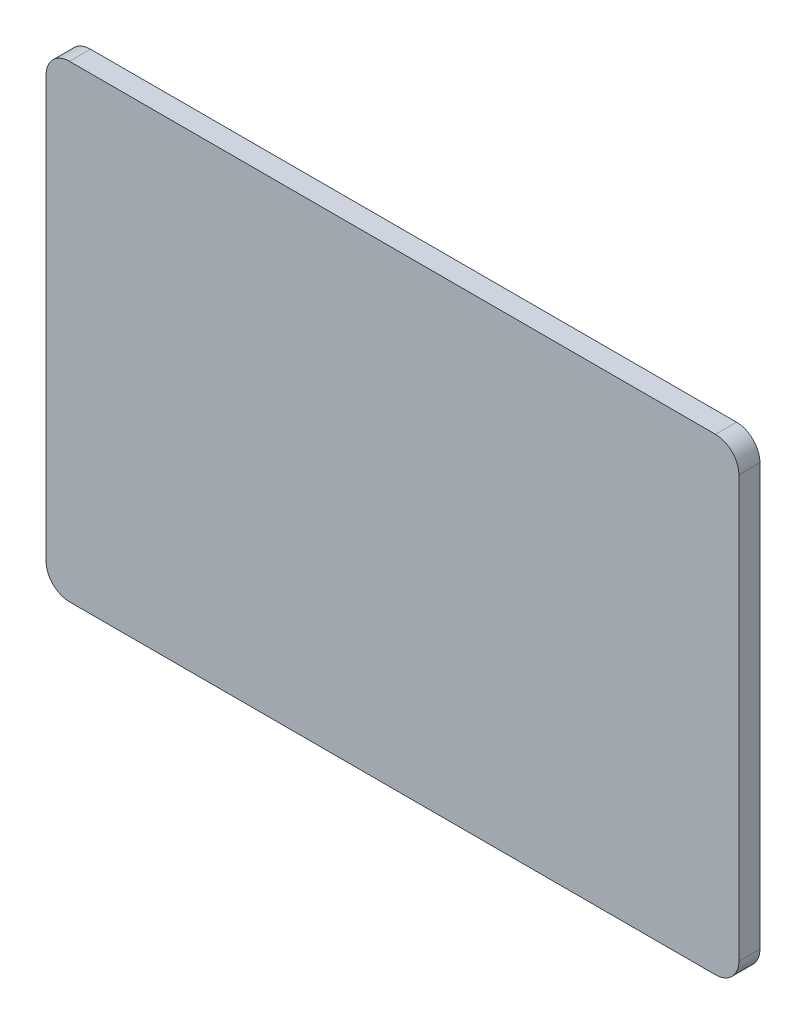
ISO-10303-21;
HEADER;
FILE_DESCRIPTION(('STEP AP214'),'2;1');
FILE_NAME('part.step','',(''),(''),'','','');
FILE_SCHEMA(('AUTOMOTIVE_DESIGN { 1 0 10303 214 1 1 1 1 }'));
ENDSEC;
DATA;
#1=APPLICATION_CONTEXT('core data for automotive mechanical design processes');
#2=APPLICATION_PROTOCOL_DEFINITION('international standard','automotive_design',2000,#1);
#3=PRODUCT_CONTEXT('',#1,'mechanical');
#4=PRODUCT('Part','Part','',(#3));
#5=PRODUCT_RELATED_PRODUCT_CATEGORY('part','',(#4));
#6=PRODUCT_DEFINITION_FORMATION('','',#4);
#7=PRODUCT_DEFINITION_CONTEXT('part definition',#1,'design');
#8=PRODUCT_DEFINITION('design','',#6,#7);
#9=PRODUCT_DEFINITION_SHAPE('','',#8);
#10=(LENGTH_UNIT() NAMED_UNIT(*) SI_UNIT(.MILLI.,.METRE.));
#11=(NAMED_UNIT(*) PLANE_ANGLE_UNIT() SI_UNIT($,.RADIAN.));
#12=(NAMED_UNIT(*) SI_UNIT($,.STERADIAN.) SOLID_ANGLE_UNIT());
#13=UNCERTAINTY_MEASURE_WITH_UNIT(LENGTH_MEASURE(1.E-05),#10,'distance_accuracy_value','');
#14=(GEOMETRIC_REPRESENTATION_CONTEXT(3) GLOBAL_UNCERTAINTY_ASSIGNED_CONTEXT((#13)) GLOBAL_UNIT_ASSIGNED_CONTEXT((#10,
#11,#12)) REPRESENTATION_CONTEXT('',''));
#15=CARTESIAN_POINT('',(0.,0.,0.));
#16=DIRECTION('',(0.,0.,1.));
#17=DIRECTION('',(1.,0.,0.));
#18=AXIS2_PLACEMENT_3D('',#15,#16,#17);
#19=CARTESIAN_POINT('',(-0.345,0.225,0.30877));
#20=DIRECTION('',(0.,0.,1.));
#21=DIRECTION('',(-1.,0.,0.));
#22=AXIS2_PLACEMENT_3D('',#19,#20,#21);
#23=CYLINDRICAL_SURFACE('',#22,0.025);
#24=CARTESIAN_POINT('',(-0.345,0.225,0.29754));
#25=DIRECTION('',(0.,0.,-1.));
#26=DIRECTION('',(1.,0.,0.));
#27=AXIS2_PLACEMENT_3D('',#24,#25,#26);
#28=CIRCLE('',#27,0.025);
#29=CARTESIAN_POINT('',(-0.37,0.225,0.29754));
#30=VERTEX_POINT('',#29);
#31=CARTESIAN_POINT('',(-0.345,0.25,0.29754));
#32=VERTEX_POINT('',#31);
#33=EDGE_CURVE('E42',#30,#32,#28,.T.);
#34=ORIENTED_EDGE('',*,*,#33,.F.);
#35=DIRECTION('',(0.,0.,-1.));
#36=VECTOR('',#35,1.);
#37=CARTESIAN_POINT('',(-0.37,0.225,0.29754));
#38=LINE('',#37,#36);
#39=CARTESIAN_POINT('',(-0.37,0.225,0.32));
#40=VERTEX_POINT('',#39);
#41=EDGE_CURVE('E28',#40,#30,#38,.T.);
#42=ORIENTED_EDGE('',*,*,#41,.F.);
#43=CARTESIAN_POINT('',(-0.345,0.225,0.32));
#44=DIRECTION('',(0.,0.,1.));
#45=DIRECTION('',(1.,0.,0.));
#46=AXIS2_PLACEMENT_3D('',#43,#44,#45);
#47=CIRCLE('',#46,0.025);
#48=CARTESIAN_POINT('',(-0.345,0.25,0.32));
#49=VERTEX_POINT('',#48);
#50=EDGE_CURVE('E177',#49,#40,#47,.T.);
#51=ORIENTED_EDGE('',*,*,#50,.F.);
#52=DIRECTION('',(0.,0.,1.));
#53=VECTOR('',#52,1.);
#54=CARTESIAN_POINT('',(-0.345,0.25,0.32));
#55=LINE('',#54,#53);
#56=EDGE_CURVE('E184',#32,#49,#55,.T.);
#57=ORIENTED_EDGE('',*,*,#56,.F.);
#58=EDGE_LOOP('',(#34,#42,#51,#57));
#59=FACE_BOUND('',#58,.T.);
#60=ADVANCED_FACE('F17',(#59),#23,.T.);
#61=CARTESIAN_POINT('',(0.345,-0.225,0.30877));
#62=DIRECTION('',(0.,0.,1.));
#63=DIRECTION('',(-1.,0.,0.));
#64=AXIS2_PLACEMENT_3D('',#61,#62,#63);
#65=CYLINDRICAL_SURFACE('',#64,0.025);
#66=CARTESIAN_POINT('',(0.345,-0.225,0.29754));
#67=DIRECTION('',(0.,0.,-1.));
#68=DIRECTION('',(1.,0.,0.));
#69=AXIS2_PLACEMENT_3D('',#66,#67,#68);
#70=CIRCLE('',#69,0.025);
#71=CARTESIAN_POINT('',(0.37,-0.225,0.29754));
#72=VERTEX_POINT('',#71);
#73=CARTESIAN_POINT('',(0.345,-0.25,0.29754));
#74=VERTEX_POINT('',#73);
#75=EDGE_CURVE('E151',#72,#74,#70,.T.);
#76=ORIENTED_EDGE('',*,*,#75,.F.);
#77=DIRECTION('',(0.,0.,-1.));
#78=VECTOR('',#77,1.);
#79=CARTESIAN_POINT('',(0.37,-0.225,0.29754));
#80=LINE('',#79,#78);
#81=CARTESIAN_POINT('',(0.37,-0.225,0.32));
#82=VERTEX_POINT('',#81);
#83=EDGE_CURVE('E63',#82,#72,#80,.T.);
#84=ORIENTED_EDGE('',*,*,#83,.F.);
#85=CARTESIAN_POINT('',(0.345,-0.225,0.32));
#86=DIRECTION('',(0.,0.,1.));
#87=DIRECTION('',(1.,0.,0.));
#88=AXIS2_PLACEMENT_3D('',#85,#86,#87);
#89=CIRCLE('',#88,0.025);
#90=CARTESIAN_POINT('',(0.345,-0.25,0.32));
#91=VERTEX_POINT('',#90);
#92=EDGE_CURVE('E76',#91,#82,#89,.T.);
#93=ORIENTED_EDGE('',*,*,#92,.F.);
#94=DIRECTION('',(0.,0.,1.));
#95=VECTOR('',#94,1.);
#96=CARTESIAN_POINT('',(0.345,-0.25,0.32));
#97=LINE('',#96,#95);
#98=EDGE_CURVE('E185',#74,#91,#97,.T.);
#99=ORIENTED_EDGE('',*,*,#98,.F.);
#100=EDGE_LOOP('',(#76,#84,#93,#99));
#101=FACE_BOUND('',#100,.T.);
#102=ADVANCED_FACE('F290',(#101),#65,.T.);
#103=CARTESIAN_POINT('',(0.345,0.225,0.30877));
#104=DIRECTION('',(0.,0.,-1.));
#105=DIRECTION('',(1.,0.,0.));
#106=AXIS2_PLACEMENT_3D('',#103,#104,#105);
#107=CYLINDRICAL_SURFACE('',#106,0.025);
#108=CARTESIAN_POINT('',(0.345,0.225,0.29754));
#109=DIRECTION('',(0.,0.,-1.));
#110=DIRECTION('',(1.,0.,0.));
#111=AXIS2_PLACEMENT_3D('',#108,#109,#110);
#112=CIRCLE('',#111,0.025);
#113=CARTESIAN_POINT('',(0.345,0.25,0.29754));
#114=VERTEX_POINT('',#113);
#115=CARTESIAN_POINT('',(0.37,0.225,0.29754));
#116=VERTEX_POINT('',#115);
#117=EDGE_CURVE('E141',#114,#116,#112,.T.);
#118=ORIENTED_EDGE('',*,*,#117,.F.);
#119=DIRECTION('',(0.,0.,-1.));
#120=VECTOR('',#119,1.);
#121=CARTESIAN_POINT('',(0.345,0.25,0.30877));
#122=LINE('',#121,#120);
#123=CARTESIAN_POINT('',(0.345,0.25,0.32));
#124=VERTEX_POINT('',#123);
#125=EDGE_CURVE('E97',#124,#114,#122,.T.);
#126=ORIENTED_EDGE('',*,*,#125,.F.);
#127=CARTESIAN_POINT('',(0.345,0.225,0.32));
#128=DIRECTION('',(0.,0.,1.));
#129=DIRECTION('',(1.,0.,0.));
#130=AXIS2_PLACEMENT_3D('',#127,#128,#129);
#131=CIRCLE('',#130,0.025);
#132=CARTESIAN_POINT('',(0.37,0.225,0.32));
#133=VERTEX_POINT('',#132);
#134=EDGE_CURVE('E143',#133,#124,#131,.T.);
#135=ORIENTED_EDGE('',*,*,#134,.F.);
#136=DIRECTION('',(0.,0.,1.));
#137=VECTOR('',#136,1.);
#138=CARTESIAN_POINT('',(0.37,0.225,0.30877));
#139=LINE('',#138,#137);
#140=EDGE_CURVE('E138',#116,#133,#139,.T.);
#141=ORIENTED_EDGE('',*,*,#140,.F.);
#142=EDGE_LOOP('',(#118,#126,#135,#141));
#143=FACE_BOUND('',#142,.T.);
#144=ADVANCED_FACE('F140',(#143),#107,.T.);
#145=CARTESIAN_POINT('',(-0.37,-0.25,0.30877));
#146=DIRECTION('',(-1.,0.,0.));
#147=DIRECTION('',(0.,0.,1.));
#148=AXIS2_PLACEMENT_3D('',#145,#146,#147);
#149=PLANE('',#148);
#150=DIRECTION('',(0.,1.,0.));
#151=VECTOR('',#150,1.);
#152=CARTESIAN_POINT('',(-0.37,-0.25,0.32));
#153=LINE('',#152,#151);
#154=CARTESIAN_POINT('',(-0.37,-0.225,0.32));
#155=VERTEX_POINT('',#154);
#156=EDGE_CURVE('E11',#155,#40,#153,.T.);
#157=ORIENTED_EDGE('',*,*,#156,.T.);
#158=ORIENTED_EDGE('',*,*,#41,.T.);
#159=DIRECTION('',(0.,1.,0.));
#160=VECTOR('',#159,1.);
#161=CARTESIAN_POINT('',(-0.37,-0.25,0.29754));
#162=LINE('',#161,#160);
#163=CARTESIAN_POINT('',(-0.37,-0.225,0.29754));
#164=VERTEX_POINT('',#163);
#165=EDGE_CURVE('E134',#164,#30,#162,.T.);
#166=ORIENTED_EDGE('',*,*,#165,.F.);
#167=DIRECTION('',(0.,0.,1.));
#168=VECTOR('',#167,1.);
#169=CARTESIAN_POINT('',(-0.37,-0.225,0.30877));
#170=LINE('',#169,#168);
#171=EDGE_CURVE('E130',#164,#155,#170,.T.);
#172=ORIENTED_EDGE('',*,*,#171,.T.);
#173=EDGE_LOOP('',(#157,#158,#166,#172));
#174=FACE_BOUND('',#173,.T.);
#175=ADVANCED_FACE('F282',(#174),#149,.T.);
#176=CARTESIAN_POINT('',(0.,-0.25,0.29754));
#177=DIRECTION('',(0.,0.,1.));
#178=DIRECTION('',(1.,0.,0.));
#179=AXIS2_PLACEMENT_3D('',#176,#177,#178);
#180=PLANE('',#179);
#181=DIRECTION('',(1.,0.,0.));
#182=VECTOR('',#181,1.);
#183=CARTESIAN_POINT('',(0.,0.25,0.29754));
#184=LINE('',#183,#182);
#185=EDGE_CURVE('E149',#32,#114,#184,.T.);
#186=ORIENTED_EDGE('',*,*,#185,.T.);
#187=ORIENTED_EDGE('',*,*,#117,.T.);
#188=DIRECTION('',(0.,1.,0.));
#189=VECTOR('',#188,1.);
#190=CARTESIAN_POINT('',(0.37,-0.25,0.29754));
#191=LINE('',#190,#189);
#192=EDGE_CURVE('E145',#72,#116,#191,.T.);
#193=ORIENTED_EDGE('',*,*,#192,.F.);
#194=ORIENTED_EDGE('',*,*,#75,.T.);
#195=DIRECTION('',(1.,0.,0.));
#196=VECTOR('',#195,1.);
#197=CARTESIAN_POINT('',(0.,-0.25,0.29754));
#198=LINE('',#197,#196);
#199=CARTESIAN_POINT('',(-0.345,-0.25,0.29754));
#200=VERTEX_POINT('',#199);
#201=EDGE_CURVE('E122',#200,#74,#198,.T.);
#202=ORIENTED_EDGE('',*,*,#201,.F.);
#203=CARTESIAN_POINT('',(-0.345,-0.225,0.29754));
#204=DIRECTION('',(0.,0.,-1.));
#205=DIRECTION('',(1.,0.,0.));
#206=AXIS2_PLACEMENT_3D('',#203,#204,#205);
#207=CIRCLE('',#206,0.025);
#208=EDGE_CURVE('E171',#200,#164,#207,.T.);
#209=ORIENTED_EDGE('',*,*,#208,.T.);
#210=ORIENTED_EDGE('',*,*,#165,.T.);
#211=ORIENTED_EDGE('',*,*,#33,.T.);
#212=EDGE_LOOP('',(#186,#187,#193,#194,#202,#209,#210,#211));
#213=FACE_BOUND('',#212,.T.);
#214=ADVANCED_FACE('F148',(#213),#180,.F.);
#215=CARTESIAN_POINT('',(0.37,-0.25,0.30877));
#216=DIRECTION('',(-1.,0.,0.));
#217=DIRECTION('',(0.,0.,1.));
#218=AXIS2_PLACEMENT_3D('',#215,#216,#217);
#219=PLANE('',#218);
#220=ORIENTED_EDGE('',*,*,#192,.T.);
#221=ORIENTED_EDGE('',*,*,#140,.T.);
#222=DIRECTION('',(0.,1.,0.));
#223=VECTOR('',#222,1.);
#224=CARTESIAN_POINT('',(0.37,-0.25,0.32));
#225=LINE('',#224,#223);
#226=EDGE_CURVE('E166',#82,#133,#225,.T.);
#227=ORIENTED_EDGE('',*,*,#226,.F.);
#228=ORIENTED_EDGE('',*,*,#83,.T.);
#229=EDGE_LOOP('',(#220,#221,#227,#228));
#230=FACE_BOUND('',#229,.T.);
#231=ADVANCED_FACE('F153',(#230),#219,.F.);
#232=CARTESIAN_POINT('',(0.,-0.25,0.32));
#233=DIRECTION('',(0.,0.,1.));
#234=DIRECTION('',(1.,0.,0.));
#235=AXIS2_PLACEMENT_3D('',#232,#233,#234);
#236=PLANE('',#235);
#237=ORIENTED_EDGE('',*,*,#226,.T.);
#238=ORIENTED_EDGE('',*,*,#134,.T.);
#239=DIRECTION('',(1.,0.,0.));
#240=VECTOR('',#239,1.);
#241=CARTESIAN_POINT('',(0.,0.25,0.32));
#242=LINE('',#241,#240);
#243=EDGE_CURVE('E189',#49,#124,#242,.T.);
#244=ORIENTED_EDGE('',*,*,#243,.F.);
#245=ORIENTED_EDGE('',*,*,#50,.T.);
#246=ORIENTED_EDGE('',*,*,#156,.F.);
#247=CARTESIAN_POINT('',(-0.345,-0.225,0.32));
#248=DIRECTION('',(0.,0.,1.));
#249=DIRECTION('',(1.,0.,0.));
#250=AXIS2_PLACEMENT_3D('',#247,#248,#249);
#251=CIRCLE('',#250,0.025);
#252=CARTESIAN_POINT('',(-0.345,-0.25,0.32));
#253=VERTEX_POINT('',#252);
#254=EDGE_CURVE('E174',#155,#253,#251,.T.);
#255=ORIENTED_EDGE('',*,*,#254,.T.);
#256=DIRECTION('',(1.,0.,0.));
#257=VECTOR('',#256,1.);
#258=CARTESIAN_POINT('',(0.,-0.25,0.32));
#259=LINE('',#258,#257);
#260=EDGE_CURVE('E178',#253,#91,#259,.T.);
#261=ORIENTED_EDGE('',*,*,#260,.T.);
#262=ORIENTED_EDGE('',*,*,#92,.T.);
#263=EDGE_LOOP('',(#237,#238,#244,#245,#246,#255,#261,#262));
#264=FACE_BOUND('',#263,.T.);
#265=ADVANCED_FACE('F19',(#264),#236,.T.);
#266=CARTESIAN_POINT('',(0.,0.25,0.30877));
#267=DIRECTION('',(0.,-1.,0.));
#268=DIRECTION('',(0.,0.,-1.));
#269=AXIS2_PLACEMENT_3D('',#266,#267,#268);
#270=PLANE('',#269);
#271=ORIENTED_EDGE('',*,*,#243,.T.);
#272=ORIENTED_EDGE('',*,*,#125,.T.);
#273=ORIENTED_EDGE('',*,*,#185,.F.);
#274=ORIENTED_EDGE('',*,*,#56,.T.);
#275=EDGE_LOOP('',(#271,#272,#273,#274));
#276=FACE_BOUND('',#275,.T.);
#277=ADVANCED_FACE('F259',(#276),#270,.F.);
#278=CARTESIAN_POINT('',(0.,-0.25,0.30877));
#279=DIRECTION('',(0.,-1.,0.));
#280=DIRECTION('',(0.,0.,-1.));
#281=AXIS2_PLACEMENT_3D('',#278,#279,#280);
#282=PLANE('',#281);
#283=ORIENTED_EDGE('',*,*,#201,.T.);
#284=ORIENTED_EDGE('',*,*,#98,.T.);
#285=ORIENTED_EDGE('',*,*,#260,.F.);
#286=DIRECTION('',(0.,0.,-1.));
#287=VECTOR('',#286,1.);
#288=CARTESIAN_POINT('',(-0.345,-0.25,0.30877));
#289=LINE('',#288,#287);
#290=EDGE_CURVE('E21',#253,#200,#289,.T.);
#291=ORIENTED_EDGE('',*,*,#290,.T.);
#292=EDGE_LOOP('',(#283,#284,#285,#291));
#293=FACE_BOUND('',#292,.T.);
#294=ADVANCED_FACE('F263',(#293),#282,.T.);
#295=CARTESIAN_POINT('',(-0.345,-0.225,0.30877));
#296=DIRECTION('',(0.,0.,-1.));
#297=DIRECTION('',(1.,0.,0.));
#298=AXIS2_PLACEMENT_3D('',#295,#296,#297);
#299=CYLINDRICAL_SURFACE('',#298,0.025);
#300=ORIENTED_EDGE('',*,*,#208,.F.);
#301=ORIENTED_EDGE('',*,*,#290,.F.);
#302=ORIENTED_EDGE('',*,*,#254,.F.);
#303=ORIENTED_EDGE('',*,*,#171,.F.);
#304=EDGE_LOOP('',(#300,#301,#302,#303));
#305=FACE_BOUND('',#304,.T.);
#306=ADVANCED_FACE('F267',(#305),#299,.T.);
#307=CLOSED_SHELL('',(#60,#102,#144,#175,#214,#231,#265,#277,#294,#306));
#308=MANIFOLD_SOLID_BREP('B1',#307);
#309=ADVANCED_BREP_SHAPE_REPRESENTATION('',(#18,#308),#14);
#310=SHAPE_DEFINITION_REPRESENTATION(#9,#309);
ENDSEC;
END-ISO-10303-21;
